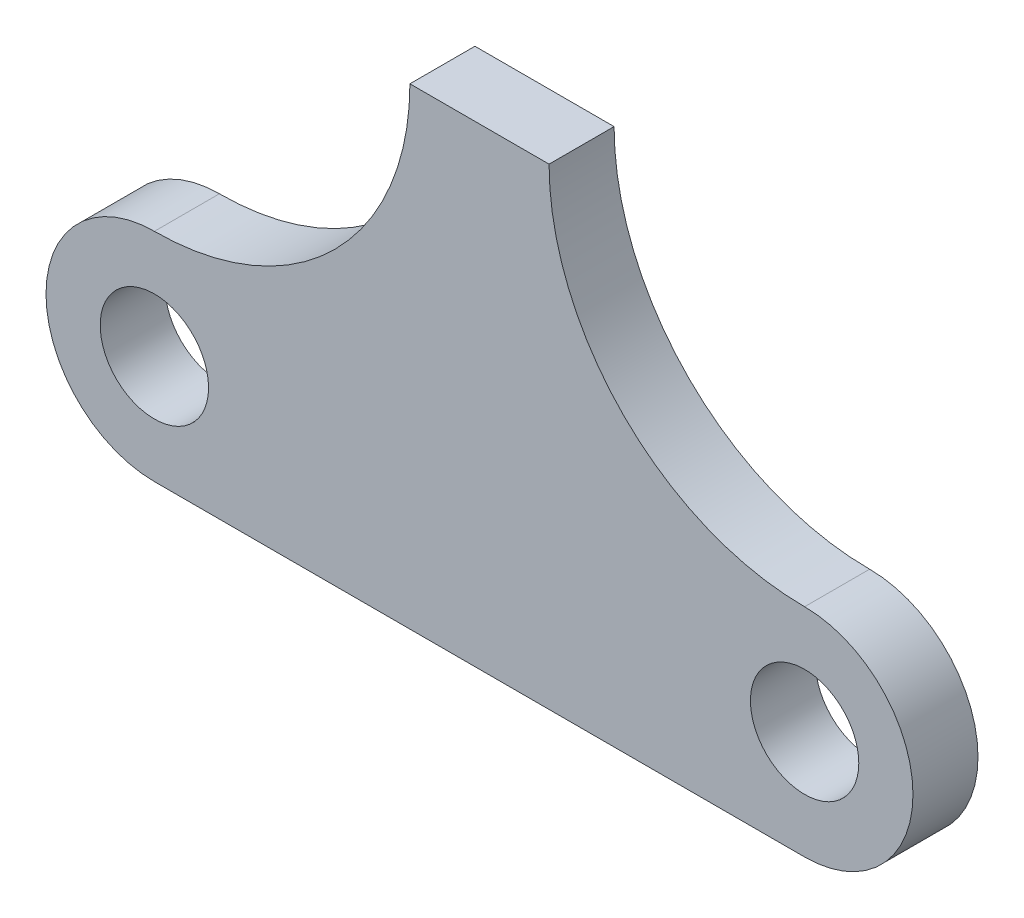
ISO-10303-21;
HEADER;
FILE_DESCRIPTION(('STEP AP214'),'2;1');
FILE_NAME('part.step','',(''),(''),'','','');
FILE_SCHEMA(('AUTOMOTIVE_DESIGN { 1 0 10303 214 1 1 1 1 }'));
ENDSEC;
DATA;
#1=APPLICATION_CONTEXT('core data for automotive mechanical design processes');
#2=APPLICATION_PROTOCOL_DEFINITION('international standard','automotive_design',2000,#1);
#3=PRODUCT_CONTEXT('',#1,'mechanical');
#4=PRODUCT('Part','Part','',(#3));
#5=PRODUCT_RELATED_PRODUCT_CATEGORY('part','',(#4));
#6=PRODUCT_DEFINITION_FORMATION('','',#4);
#7=PRODUCT_DEFINITION_CONTEXT('part definition',#1,'design');
#8=PRODUCT_DEFINITION('design','',#6,#7);
#9=PRODUCT_DEFINITION_SHAPE('','',#8);
#10=(LENGTH_UNIT() NAMED_UNIT(*) SI_UNIT(.MILLI.,.METRE.));
#11=(NAMED_UNIT(*) PLANE_ANGLE_UNIT() SI_UNIT($,.RADIAN.));
#12=(NAMED_UNIT(*) SI_UNIT($,.STERADIAN.) SOLID_ANGLE_UNIT());
#13=UNCERTAINTY_MEASURE_WITH_UNIT(LENGTH_MEASURE(1.E-05),#10,'distance_accuracy_value','');
#14=(GEOMETRIC_REPRESENTATION_CONTEXT(3) GLOBAL_UNCERTAINTY_ASSIGNED_CONTEXT((#13)) GLOBAL_UNIT_ASSIGNED_CONTEXT((#10,
#11,#12)) REPRESENTATION_CONTEXT('',''));
#15=CARTESIAN_POINT('',(0.,0.,0.));
#16=DIRECTION('',(0.,0.,1.));
#17=DIRECTION('',(1.,0.,0.));
#18=AXIS2_PLACEMENT_3D('',#15,#16,#17);
#19=CARTESIAN_POINT('',(15.,0.,3.));
#20=DIRECTION('',(0.,0.,-1.));
#21=DIRECTION('',(-1.,0.,0.));
#22=AXIS2_PLACEMENT_3D('',#19,#20,#21);
#23=CYLINDRICAL_SURFACE('',#22,5.);
#24=CARTESIAN_POINT('',(15.,0.,0.));
#25=DIRECTION('',(0.,0.,1.));
#26=DIRECTION('',(1.,0.,0.));
#27=AXIS2_PLACEMENT_3D('',#24,#25,#26);
#28=CIRCLE('',#27,5.);
#29=CARTESIAN_POINT('',(15.,-4.99999999999999,0.));
#30=VERTEX_POINT('',#29);
#31=CARTESIAN_POINT('',(15.,5.00000000000001,0.));
#32=VERTEX_POINT('',#31);
#33=EDGE_CURVE('E141',#30,#32,#28,.T.);
#34=ORIENTED_EDGE('',*,*,#33,.T.);
#35=DIRECTION('',(0.,0.,-1.));
#36=VECTOR('',#35,1.);
#37=CARTESIAN_POINT('',(15.,5.00000000000001,3.));
#38=LINE('',#37,#36);
#39=CARTESIAN_POINT('',(15.,5.00000000000001,3.));
#40=VERTEX_POINT('',#39);
#41=EDGE_CURVE('E11',#40,#32,#38,.T.);
#42=ORIENTED_EDGE('',*,*,#41,.F.);
#43=CARTESIAN_POINT('',(15.,0.,3.));
#44=DIRECTION('',(0.,0.,1.));
#45=DIRECTION('',(1.,0.,0.));
#46=AXIS2_PLACEMENT_3D('',#43,#44,#45);
#47=CIRCLE('',#46,5.);
#48=CARTESIAN_POINT('',(15.,-4.99999999999999,3.));
#49=VERTEX_POINT('',#48);
#50=EDGE_CURVE('E275',#49,#40,#47,.T.);
#51=ORIENTED_EDGE('',*,*,#50,.F.);
#52=DIRECTION('',(0.,0.,-1.));
#53=VECTOR('',#52,1.);
#54=CARTESIAN_POINT('',(15.,-4.99999999999999,3.));
#55=LINE('',#54,#53);
#56=EDGE_CURVE('E59',#49,#30,#55,.T.);
#57=ORIENTED_EDGE('',*,*,#56,.T.);
#58=EDGE_LOOP('',(#34,#42,#51,#57));
#59=FACE_BOUND('',#58,.T.);
#60=ADVANCED_FACE('F41',(#59),#23,.T.);
#61=CARTESIAN_POINT('',(15.,16.7899454471865,3.));
#62=DIRECTION('',(0.,0.,-1.));
#63=DIRECTION('',(-1.,0.,0.));
#64=AXIS2_PLACEMENT_3D('',#61,#62,#63);
#65=CYLINDRICAL_SURFACE('',#64,11.7899454471865);
#66=CARTESIAN_POINT('',(15.,16.7899454471865,0.));
#67=DIRECTION('',(0.,0.,1.));
#68=DIRECTION('',(1.,0.,0.));
#69=AXIS2_PLACEMENT_3D('',#66,#67,#68);
#70=CIRCLE('',#69,11.7899454471865);
#71=CARTESIAN_POINT('',(3.21005455281352,16.7899454471865,0.));
#72=VERTEX_POINT('',#71);
#73=EDGE_CURVE('E144',#32,#72,#70,.F.);
#74=ORIENTED_EDGE('',*,*,#73,.T.);
#75=DIRECTION('',(0.,0.,-1.));
#76=VECTOR('',#75,1.);
#77=CARTESIAN_POINT('',(3.21005455281352,16.7899454471865,3.));
#78=LINE('',#77,#76);
#79=CARTESIAN_POINT('',(3.21005455281352,16.7899454471865,3.));
#80=VERTEX_POINT('',#79);
#81=EDGE_CURVE('E51',#80,#72,#78,.T.);
#82=ORIENTED_EDGE('',*,*,#81,.F.);
#83=CARTESIAN_POINT('',(15.,16.7899454471865,3.));
#84=DIRECTION('',(0.,0.,1.));
#85=DIRECTION('',(1.,0.,0.));
#86=AXIS2_PLACEMENT_3D('',#83,#84,#85);
#87=CIRCLE('',#86,11.7899454471865);
#88=EDGE_CURVE('E92',#40,#80,#87,.F.);
#89=ORIENTED_EDGE('',*,*,#88,.F.);
#90=ORIENTED_EDGE('',*,*,#41,.T.);
#91=EDGE_LOOP('',(#74,#82,#89,#90));
#92=FACE_BOUND('',#91,.T.);
#93=ADVANCED_FACE('F171',(#92),#65,.F.);
#94=CARTESIAN_POINT('',(0.,16.7899454471865,3.));
#95=DIRECTION('',(0.,1.,0.));
#96=DIRECTION('',(-1.,0.,0.));
#97=AXIS2_PLACEMENT_3D('',#94,#95,#96);
#98=PLANE('',#97);
#99=DIRECTION('',(1.,0.,0.));
#100=VECTOR('',#99,1.);
#101=CARTESIAN_POINT('',(0.,16.7899454471865,0.));
#102=LINE('',#101,#100);
#103=CARTESIAN_POINT('',(-3.21005455281353,16.7899454471865,0.));
#104=VERTEX_POINT('',#103);
#105=EDGE_CURVE('E148',#104,#72,#102,.T.);
#106=ORIENTED_EDGE('',*,*,#105,.F.);
#107=DIRECTION('',(0.,0.,-1.));
#108=VECTOR('',#107,1.);
#109=CARTESIAN_POINT('',(-3.21005455281353,16.7899454471865,3.));
#110=LINE('',#109,#108);
#111=CARTESIAN_POINT('',(-3.21005455281353,16.7899454471865,3.));
#112=VERTEX_POINT('',#111);
#113=EDGE_CURVE('E112',#112,#104,#110,.T.);
#114=ORIENTED_EDGE('',*,*,#113,.F.);
#115=DIRECTION('',(1.,0.,0.));
#116=VECTOR('',#115,1.);
#117=CARTESIAN_POINT('',(0.,16.7899454471865,3.));
#118=LINE('',#117,#116);
#119=EDGE_CURVE('E124',#112,#80,#118,.T.);
#120=ORIENTED_EDGE('',*,*,#119,.T.);
#121=ORIENTED_EDGE('',*,*,#81,.T.);
#122=EDGE_LOOP('',(#106,#114,#120,#121));
#123=FACE_BOUND('',#122,.T.);
#124=ADVANCED_FACE('F170',(#123),#98,.T.);
#125=CARTESIAN_POINT('',(-15.,16.7899454471865,3.));
#126=DIRECTION('',(0.,0.,-1.));
#127=DIRECTION('',(-1.,0.,0.));
#128=AXIS2_PLACEMENT_3D('',#125,#126,#127);
#129=CYLINDRICAL_SURFACE('',#128,11.7899454471865);
#130=CARTESIAN_POINT('',(-15.,16.7899454471865,0.));
#131=DIRECTION('',(0.,0.,1.));
#132=DIRECTION('',(1.,0.,0.));
#133=AXIS2_PLACEMENT_3D('',#130,#131,#132);
#134=CIRCLE('',#133,11.7899454471865);
#135=CARTESIAN_POINT('',(-15.,5.,0.));
#136=VERTEX_POINT('',#135);
#137=EDGE_CURVE('E108',#136,#104,#134,.T.);
#138=ORIENTED_EDGE('',*,*,#137,.F.);
#139=DIRECTION('',(0.,0.,-1.));
#140=VECTOR('',#139,1.);
#141=CARTESIAN_POINT('',(-15.,5.,3.));
#142=LINE('',#141,#140);
#143=CARTESIAN_POINT('',(-15.,5.,3.));
#144=VERTEX_POINT('',#143);
#145=EDGE_CURVE('E102',#144,#136,#142,.T.);
#146=ORIENTED_EDGE('',*,*,#145,.F.);
#147=CARTESIAN_POINT('',(-15.,16.7899454471865,3.));
#148=DIRECTION('',(0.,0.,1.));
#149=DIRECTION('',(1.,0.,0.));
#150=AXIS2_PLACEMENT_3D('',#147,#148,#149);
#151=CIRCLE('',#150,11.7899454471865);
#152=EDGE_CURVE('E106',#144,#112,#151,.T.);
#153=ORIENTED_EDGE('',*,*,#152,.T.);
#154=ORIENTED_EDGE('',*,*,#113,.T.);
#155=EDGE_LOOP('',(#138,#146,#153,#154));
#156=FACE_BOUND('',#155,.T.);
#157=ADVANCED_FACE('F104',(#156),#129,.F.);
#158=CARTESIAN_POINT('',(-15.,0.,3.));
#159=DIRECTION('',(0.,0.,-1.));
#160=DIRECTION('',(-1.,0.,0.));
#161=AXIS2_PLACEMENT_3D('',#158,#159,#160);
#162=CYLINDRICAL_SURFACE('',#161,5.);
#163=CARTESIAN_POINT('',(-15.,0.,0.));
#164=DIRECTION('',(0.,0.,1.));
#165=DIRECTION('',(1.,0.,0.));
#166=AXIS2_PLACEMENT_3D('',#163,#164,#165);
#167=CIRCLE('',#166,5.);
#168=CARTESIAN_POINT('',(-15.,-5.,0.));
#169=VERTEX_POINT('',#168);
#170=EDGE_CURVE('E154',#136,#169,#167,.T.);
#171=ORIENTED_EDGE('',*,*,#170,.T.);
#172=DIRECTION('',(0.,0.,-1.));
#173=VECTOR('',#172,1.);
#174=CARTESIAN_POINT('',(-15.,-5.,3.));
#175=LINE('',#174,#173);
#176=CARTESIAN_POINT('',(-15.,-5.,3.));
#177=VERTEX_POINT('',#176);
#178=EDGE_CURVE('E80',#177,#169,#175,.T.);
#179=ORIENTED_EDGE('',*,*,#178,.F.);
#180=CARTESIAN_POINT('',(-15.,0.,3.));
#181=DIRECTION('',(0.,0.,1.));
#182=DIRECTION('',(1.,0.,0.));
#183=AXIS2_PLACEMENT_3D('',#180,#181,#182);
#184=CIRCLE('',#183,5.);
#185=EDGE_CURVE('E114',#144,#177,#184,.T.);
#186=ORIENTED_EDGE('',*,*,#185,.F.);
#187=ORIENTED_EDGE('',*,*,#145,.T.);
#188=EDGE_LOOP('',(#171,#179,#186,#187));
#189=FACE_BOUND('',#188,.T.);
#190=ADVANCED_FACE('F115',(#189),#162,.T.);
#191=CARTESIAN_POINT('',(15.,0.,3.));
#192=DIRECTION('',(0.,0.,-1.));
#193=DIRECTION('',(-1.,0.,0.));
#194=AXIS2_PLACEMENT_3D('',#191,#192,#193);
#195=CYLINDRICAL_SURFACE('',#194,2.5);
#196=CARTESIAN_POINT('',(15.,0.,3.));
#197=DIRECTION('',(0.,0.,1.));
#198=DIRECTION('',(1.,0.,0.));
#199=AXIS2_PLACEMENT_3D('',#196,#197,#198);
#200=CIRCLE('',#199,2.5);
#201=CARTESIAN_POINT('',(17.5,0.,3.));
#202=VERTEX_POINT('',#201);
#203=EDGE_CURVE('E203',#202,#202,#200,.T.);
#204=ORIENTED_EDGE('',*,*,#203,.T.);
#205=EDGE_LOOP('',(#204));
#206=FACE_BOUND('',#205,.T.);
#207=CARTESIAN_POINT('',(15.,0.,0.));
#208=DIRECTION('',(0.,0.,1.));
#209=DIRECTION('',(1.,0.,0.));
#210=AXIS2_PLACEMENT_3D('',#207,#208,#209);
#211=CIRCLE('',#210,2.5);
#212=CARTESIAN_POINT('',(17.5,0.,0.));
#213=VERTEX_POINT('',#212);
#214=EDGE_CURVE('E137',#213,#213,#211,.T.);
#215=ORIENTED_EDGE('',*,*,#214,.F.);
#216=EDGE_LOOP('',(#215));
#217=FACE_BOUND('',#216,.T.);
#218=ADVANCED_FACE('F184',(#206,#217),#195,.F.);
#219=CARTESIAN_POINT('',(-15.,0.,3.));
#220=DIRECTION('',(0.,0.,-1.));
#221=DIRECTION('',(-1.,0.,0.));
#222=AXIS2_PLACEMENT_3D('',#219,#220,#221);
#223=CYLINDRICAL_SURFACE('',#222,2.5);
#224=CARTESIAN_POINT('',(-15.,0.,3.));
#225=DIRECTION('',(0.,0.,1.));
#226=DIRECTION('',(1.,0.,0.));
#227=AXIS2_PLACEMENT_3D('',#224,#225,#226);
#228=CIRCLE('',#227,2.5);
#229=CARTESIAN_POINT('',(-12.5,0.,3.));
#230=VERTEX_POINT('',#229);
#231=EDGE_CURVE('E161',#230,#230,#228,.T.);
#232=ORIENTED_EDGE('',*,*,#231,.T.);
#233=EDGE_LOOP('',(#232));
#234=FACE_BOUND('',#233,.T.);
#235=CARTESIAN_POINT('',(-15.,0.,0.));
#236=DIRECTION('',(0.,0.,1.));
#237=DIRECTION('',(1.,0.,0.));
#238=AXIS2_PLACEMENT_3D('',#235,#236,#237);
#239=CIRCLE('',#238,2.5);
#240=CARTESIAN_POINT('',(-12.5,0.,0.));
#241=VERTEX_POINT('',#240);
#242=EDGE_CURVE('E133',#241,#241,#239,.T.);
#243=ORIENTED_EDGE('',*,*,#242,.F.);
#244=EDGE_LOOP('',(#243));
#245=FACE_BOUND('',#244,.T.);
#246=ADVANCED_FACE('F43',(#234,#245),#223,.F.);
#247=CARTESIAN_POINT('',(0.,-5.,3.));
#248=DIRECTION('',(0.,-1.,0.));
#249=DIRECTION('',(1.,0.,0.));
#250=AXIS2_PLACEMENT_3D('',#247,#248,#249);
#251=PLANE('',#250);
#252=DIRECTION('',(-1.,0.,0.));
#253=VECTOR('',#252,1.);
#254=CARTESIAN_POINT('',(0.,-5.,0.));
#255=LINE('',#254,#253);
#256=EDGE_CURVE('E157',#30,#169,#255,.T.);
#257=ORIENTED_EDGE('',*,*,#256,.F.);
#258=ORIENTED_EDGE('',*,*,#56,.F.);
#259=DIRECTION('',(-1.,0.,0.));
#260=VECTOR('',#259,1.);
#261=CARTESIAN_POINT('',(0.,-5.,3.));
#262=LINE('',#261,#260);
#263=EDGE_CURVE('E119',#49,#177,#262,.T.);
#264=ORIENTED_EDGE('',*,*,#263,.T.);
#265=ORIENTED_EDGE('',*,*,#178,.T.);
#266=EDGE_LOOP('',(#257,#258,#264,#265));
#267=FACE_BOUND('',#266,.T.);
#268=ADVANCED_FACE('F175',(#267),#251,.T.);
#269=CARTESIAN_POINT('',(0.,0.,3.));
#270=DIRECTION('',(0.,0.,1.));
#271=DIRECTION('',(1.,0.,0.));
#272=AXIS2_PLACEMENT_3D('',#269,#270,#271);
#273=PLANE('',#272);
#274=ORIENTED_EDGE('',*,*,#231,.F.);
#275=EDGE_LOOP('',(#274));
#276=FACE_BOUND('',#275,.T.);
#277=ORIENTED_EDGE('',*,*,#203,.F.);
#278=EDGE_LOOP('',(#277));
#279=FACE_BOUND('',#278,.T.);
#280=ORIENTED_EDGE('',*,*,#50,.T.);
#281=ORIENTED_EDGE('',*,*,#88,.T.);
#282=ORIENTED_EDGE('',*,*,#119,.F.);
#283=ORIENTED_EDGE('',*,*,#152,.F.);
#284=ORIENTED_EDGE('',*,*,#185,.T.);
#285=ORIENTED_EDGE('',*,*,#263,.F.);
#286=EDGE_LOOP('',(#280,#281,#282,#283,#284,#285));
#287=FACE_BOUND('',#286,.T.);
#288=ADVANCED_FACE('F122',(#276,#279,#287),#273,.T.);
#289=CARTESIAN_POINT('',(0.,0.,0.));
#290=DIRECTION('',(0.,0.,1.));
#291=DIRECTION('',(1.,0.,0.));
#292=AXIS2_PLACEMENT_3D('',#289,#290,#291);
#293=PLANE('',#292);
#294=ORIENTED_EDGE('',*,*,#242,.T.);
#295=EDGE_LOOP('',(#294));
#296=FACE_BOUND('',#295,.T.);
#297=ORIENTED_EDGE('',*,*,#214,.T.);
#298=EDGE_LOOP('',(#297));
#299=FACE_BOUND('',#298,.T.);
#300=ORIENTED_EDGE('',*,*,#33,.F.);
#301=ORIENTED_EDGE('',*,*,#256,.T.);
#302=ORIENTED_EDGE('',*,*,#170,.F.);
#303=ORIENTED_EDGE('',*,*,#137,.T.);
#304=ORIENTED_EDGE('',*,*,#105,.T.);
#305=ORIENTED_EDGE('',*,*,#73,.F.);
#306=EDGE_LOOP('',(#300,#301,#302,#303,#304,#305));
#307=FACE_BOUND('',#306,.T.);
#308=ADVANCED_FACE('F174',(#296,#299,#307),#293,.F.);
#309=CLOSED_SHELL('',(#60,#93,#124,#157,#190,#218,#246,#268,#288,#308));
#310=MANIFOLD_SOLID_BREP('B2',#309);
#311=ADVANCED_BREP_SHAPE_REPRESENTATION('',(#18,#310),#14);
#312=SHAPE_DEFINITION_REPRESENTATION(#9,#311);
ENDSEC;
END-ISO-10303-21;
